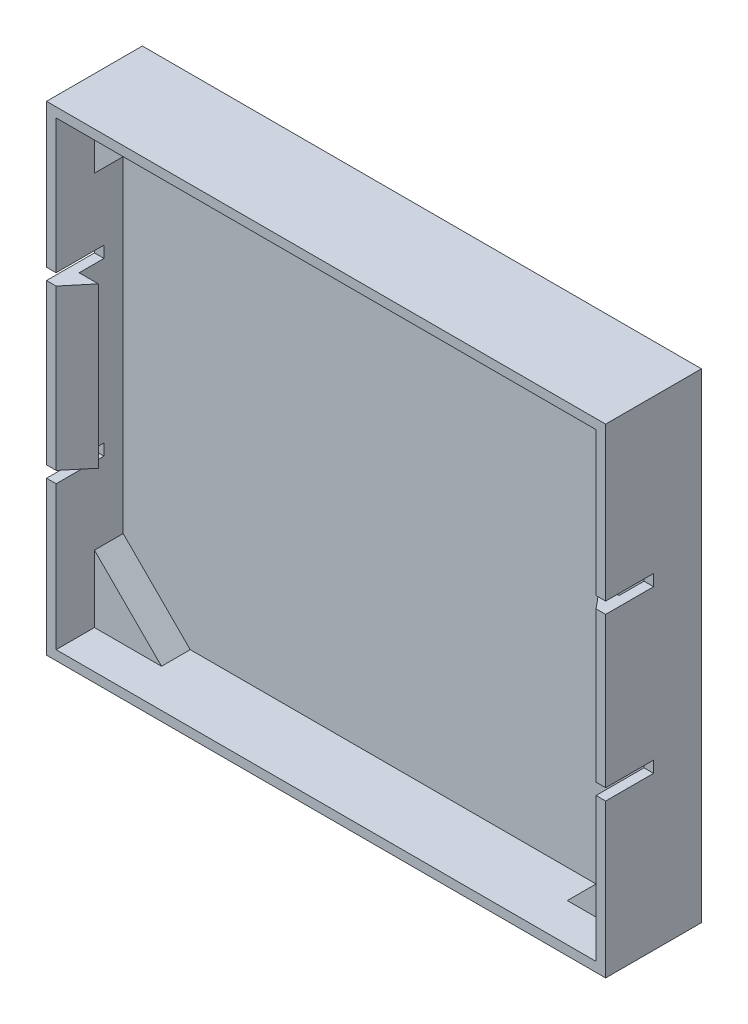
ISO-10303-21;
HEADER;
FILE_DESCRIPTION(('STEP AP214'),'2;1');
FILE_NAME('part.step','',(''),(''),'','','');
FILE_SCHEMA(('AUTOMOTIVE_DESIGN { 1 0 10303 214 1 1 1 1 }'));
ENDSEC;
DATA;
#1=APPLICATION_CONTEXT('core data for automotive mechanical design processes');
#2=APPLICATION_PROTOCOL_DEFINITION('international standard','automotive_design',2000,#1);
#3=PRODUCT_CONTEXT('',#1,'mechanical');
#4=PRODUCT('Part','Part','',(#3));
#5=PRODUCT_RELATED_PRODUCT_CATEGORY('part','',(#4));
#6=PRODUCT_DEFINITION_FORMATION('','',#4);
#7=PRODUCT_DEFINITION_CONTEXT('part definition',#1,'design');
#8=PRODUCT_DEFINITION('design','',#6,#7);
#9=PRODUCT_DEFINITION_SHAPE('','',#8);
#10=(LENGTH_UNIT() NAMED_UNIT(*) SI_UNIT(.MILLI.,.METRE.));
#11=(NAMED_UNIT(*) PLANE_ANGLE_UNIT() SI_UNIT($,.RADIAN.));
#12=(NAMED_UNIT(*) SI_UNIT($,.STERADIAN.) SOLID_ANGLE_UNIT());
#13=UNCERTAINTY_MEASURE_WITH_UNIT(LENGTH_MEASURE(1.E-05),#10,'distance_accuracy_value','');
#14=(GEOMETRIC_REPRESENTATION_CONTEXT(3) GLOBAL_UNCERTAINTY_ASSIGNED_CONTEXT((#13)) GLOBAL_UNIT_ASSIGNED_CONTEXT((#10,
#11,#12)) REPRESENTATION_CONTEXT('',''));
#15=CARTESIAN_POINT('',(0.,0.,0.));
#16=DIRECTION('',(0.,0.,1.));
#17=DIRECTION('',(1.,0.,0.));
#18=AXIS2_PLACEMENT_3D('',#15,#16,#17);
#19=CARTESIAN_POINT('',(-23.8424324324324,30.8653603603604,10.));
#20=DIRECTION('',(1.,0.,0.));
#21=DIRECTION('',(0.,1.,0.));
#22=AXIS2_PLACEMENT_3D('',#19,#20,#21);
#23=PLANE('',#22);
#24=DIRECTION('',(0.,-1.,0.));
#25=VECTOR('',#24,1.);
#26=CARTESIAN_POINT('',(-23.8424324324324,18.789460230723,7.6));
#27=LINE('',#26,#25);
#28=CARTESIAN_POINT('',(-23.8424324324324,15.6653603603604,7.6));
#29=VERTEX_POINT('',#28);
#30=CARTESIAN_POINT('',(-23.8424324324324,-1.00463963963964,7.6));
#31=VERTEX_POINT('',#30);
#32=EDGE_CURVE('E55',#29,#31,#27,.T.);
#33=ORIENTED_EDGE('',*,*,#32,.T.);
#34=DIRECTION('',(0.,0.,1.));
#35=VECTOR('',#34,1.);
#36=CARTESIAN_POINT('',(-23.8424324324324,-1.00463963963964,5.));
#37=LINE('',#36,#35);
#38=CARTESIAN_POINT('',(-23.8424324324324,-1.00463963963964,5.));
#39=VERTEX_POINT('',#38);
#40=EDGE_CURVE('E448',#39,#31,#37,.T.);
#41=ORIENTED_EDGE('',*,*,#40,.F.);
#42=DIRECTION('',(0.,1.,0.));
#43=VECTOR('',#42,1.);
#44=CARTESIAN_POINT('',(-23.8424324324324,0.,5.));
#45=LINE('',#44,#43);
#46=CARTESIAN_POINT('',(-23.8424324324324,-2.20463963963964,5.));
#47=VERTEX_POINT('',#46);
#48=EDGE_CURVE('E432',#47,#39,#45,.T.);
#49=ORIENTED_EDGE('',*,*,#48,.F.);
#50=DIRECTION('',(0.,0.,1.));
#51=VECTOR('',#50,1.);
#52=CARTESIAN_POINT('',(-23.8424324324324,-2.20463963963964,5.));
#53=LINE('',#52,#51);
#54=CARTESIAN_POINT('',(-23.8424324324324,-2.20463963963964,10.));
#55=VERTEX_POINT('',#54);
#56=EDGE_CURVE('E454',#47,#55,#53,.T.);
#57=ORIENTED_EDGE('',*,*,#56,.T.);
#58=DIRECTION('',(0.,-1.,0.));
#59=VECTOR('',#58,1.);
#60=CARTESIAN_POINT('',(-23.8424324324324,30.8653603603604,10.));
#61=LINE('',#60,#59);
#62=CARTESIAN_POINT('',(-23.8424324324324,-17.2046396396396,10.));
#63=VERTEX_POINT('',#62);
#64=EDGE_CURVE('E559',#55,#63,#61,.T.);
#65=ORIENTED_EDGE('',*,*,#64,.T.);
#66=DIRECTION('',(0.,0.,-1.));
#67=VECTOR('',#66,1.);
#68=CARTESIAN_POINT('',(-23.8424324324324,-17.2046396396396,10.));
#69=LINE('',#68,#67);
#70=CARTESIAN_POINT('',(-23.8424324324324,-17.2046396396396,6.));
#71=VERTEX_POINT('',#70);
#72=EDGE_CURVE('E596',#63,#71,#69,.T.);
#73=ORIENTED_EDGE('',*,*,#72,.T.);
#74=DIRECTION('',(0.,-1.,0.));
#75=VECTOR('',#74,1.);
#76=CARTESIAN_POINT('',(-23.8424324324324,-17.2046396396396,6.));
#77=LINE('',#76,#75);
#78=CARTESIAN_POINT('',(-23.8424324324324,-10.2046396396396,6.));
#79=VERTEX_POINT('',#78);
#80=EDGE_CURVE('E476',#79,#71,#77,.T.);
#81=ORIENTED_EDGE('',*,*,#80,.F.);
#82=DIRECTION('',(0.,0.,-1.));
#83=VECTOR('',#82,1.);
#84=CARTESIAN_POINT('',(-23.8424324324324,-10.2046396396396,6.));
#85=LINE('',#84,#83);
#86=CARTESIAN_POINT('',(-23.8424324324324,-10.2046396396396,3.));
#87=VERTEX_POINT('',#86);
#88=EDGE_CURVE('E479',#79,#87,#85,.T.);
#89=ORIENTED_EDGE('',*,*,#88,.T.);
#90=DIRECTION('',(0.,-1.,0.));
#91=VECTOR('',#90,1.);
#92=CARTESIAN_POINT('',(-23.8424324324324,30.8653603603604,3.));
#93=LINE('',#92,#91);
#94=CARTESIAN_POINT('',(-23.8424324324324,23.8653603603604,3.));
#95=VERTEX_POINT('',#94);
#96=EDGE_CURVE('E552',#95,#87,#93,.T.);
#97=ORIENTED_EDGE('',*,*,#96,.F.);
#98=DIRECTION('',(0.,0.,-1.));
#99=VECTOR('',#98,1.);
#100=CARTESIAN_POINT('',(-23.8424324324324,23.8653603603604,6.));
#101=LINE('',#100,#99);
#102=CARTESIAN_POINT('',(-23.8424324324324,23.8653603603604,6.));
#103=VERTEX_POINT('',#102);
#104=EDGE_CURVE('E549',#103,#95,#101,.T.);
#105=ORIENTED_EDGE('',*,*,#104,.F.);
#106=DIRECTION('',(0.,-1.,0.));
#107=VECTOR('',#106,1.);
#108=CARTESIAN_POINT('',(-23.8424324324324,30.8653603603604,6.));
#109=LINE('',#108,#107);
#110=CARTESIAN_POINT('',(-23.8424324324324,30.8653603603604,6.));
#111=VERTEX_POINT('',#110);
#112=EDGE_CURVE('E536',#111,#103,#109,.T.);
#113=ORIENTED_EDGE('',*,*,#112,.F.);
#114=DIRECTION('',(0.,0.,-1.));
#115=VECTOR('',#114,1.);
#116=CARTESIAN_POINT('',(-23.8424324324324,30.8653603603604,10.));
#117=LINE('',#116,#115);
#118=CARTESIAN_POINT('',(-23.8424324324324,30.8653603603604,10.));
#119=VERTEX_POINT('',#118);
#120=EDGE_CURVE('E571',#119,#111,#117,.T.);
#121=ORIENTED_EDGE('',*,*,#120,.F.);
#122=CARTESIAN_POINT('',(-23.8424324324324,16.8653603603604,10.));
#123=VERTEX_POINT('',#122);
#124=EDGE_CURVE('E553',#119,#123,#61,.T.);
#125=ORIENTED_EDGE('',*,*,#124,.T.);
#126=DIRECTION('',(0.,0.,1.));
#127=VECTOR('',#126,1.);
#128=CARTESIAN_POINT('',(-23.8424324324324,16.8653603603604,5.));
#129=LINE('',#128,#127);
#130=CARTESIAN_POINT('',(-23.8424324324324,16.8653603603604,5.));
#131=VERTEX_POINT('',#130);
#132=EDGE_CURVE('E393',#131,#123,#129,.T.);
#133=ORIENTED_EDGE('',*,*,#132,.F.);
#134=DIRECTION('',(0.,1.,0.));
#135=VECTOR('',#134,1.);
#136=CARTESIAN_POINT('',(-23.8424324324324,0.,5.));
#137=LINE('',#136,#135);
#138=CARTESIAN_POINT('',(-23.8424324324324,15.6653603603604,5.));
#139=VERTEX_POINT('',#138);
#140=EDGE_CURVE('E367',#139,#131,#137,.T.);
#141=ORIENTED_EDGE('',*,*,#140,.F.);
#142=DIRECTION('',(0.,0.,1.));
#143=VECTOR('',#142,1.);
#144=CARTESIAN_POINT('',(-23.8424324324324,15.6653603603604,5.));
#145=LINE('',#144,#143);
#146=EDGE_CURVE('E60',#139,#29,#145,.T.);
#147=ORIENTED_EDGE('',*,*,#146,.T.);
#148=EDGE_LOOP('',(#33,#41,#49,#57,#65,#73,#81,#89,#97,#105,#113,#121,#125,#133,#141,#147));
#149=FACE_BOUND('',#148,.T.);
#150=ADVANCED_FACE('F39',(#149),#23,.T.);
#151=CARTESIAN_POINT('',(32.5175675675676,30.8653603603604,10.));
#152=DIRECTION('',(-1.,0.,0.));
#153=DIRECTION('',(0.,-1.,0.));
#154=AXIS2_PLACEMENT_3D('',#151,#152,#153);
#155=PLANE('',#154);
#156=DIRECTION('',(0.,-1.,0.));
#157=VECTOR('',#156,1.);
#158=CARTESIAN_POINT('',(32.5175675675676,17.789460230723,7.6));
#159=LINE('',#158,#157);
#160=CARTESIAN_POINT('',(32.5175675675676,14.6653603603604,7.6));
#161=VERTEX_POINT('',#160);
#162=CARTESIAN_POINT('',(32.5175675675676,-1.00463963963964,7.6));
#163=VERTEX_POINT('',#162);
#164=EDGE_CURVE('E321',#161,#163,#159,.T.);
#165=ORIENTED_EDGE('',*,*,#164,.F.);
#166=DIRECTION('',(0.,0.,1.));
#167=VECTOR('',#166,1.);
#168=CARTESIAN_POINT('',(32.5175675675676,14.6653603603604,5.));
#169=LINE('',#168,#167);
#170=CARTESIAN_POINT('',(32.5175675675676,14.6653603603604,5.));
#171=VERTEX_POINT('',#170);
#172=EDGE_CURVE('E349',#171,#161,#169,.T.);
#173=ORIENTED_EDGE('',*,*,#172,.F.);
#174=DIRECTION('',(0.,-1.,0.));
#175=VECTOR('',#174,1.);
#176=CARTESIAN_POINT('',(32.5175675675676,0.,5.));
#177=LINE('',#176,#175);
#178=CARTESIAN_POINT('',(32.5175675675676,15.8653603603604,5.));
#179=VERTEX_POINT('',#178);
#180=EDGE_CURVE('E340',#179,#171,#177,.T.);
#181=ORIENTED_EDGE('',*,*,#180,.F.);
#182=DIRECTION('',(0.,0.,1.));
#183=VECTOR('',#182,1.);
#184=CARTESIAN_POINT('',(32.5175675675676,15.8653603603604,5.));
#185=LINE('',#184,#183);
#186=CARTESIAN_POINT('',(32.5175675675676,15.8653603603604,10.));
#187=VERTEX_POINT('',#186);
#188=EDGE_CURVE('E354',#179,#187,#185,.T.);
#189=ORIENTED_EDGE('',*,*,#188,.T.);
#190=DIRECTION('',(0.,1.,0.));
#191=VECTOR('',#190,1.);
#192=CARTESIAN_POINT('',(32.5175675675676,30.8653603603604,10.));
#193=LINE('',#192,#191);
#194=CARTESIAN_POINT('',(32.5175675675676,30.8653603603604,10.));
#195=VERTEX_POINT('',#194);
#196=EDGE_CURVE('E562',#187,#195,#193,.T.);
#197=ORIENTED_EDGE('',*,*,#196,.T.);
#198=DIRECTION('',(0.,0.,-1.));
#199=VECTOR('',#198,1.);
#200=CARTESIAN_POINT('',(32.5175675675676,30.8653603603604,10.));
#201=LINE('',#200,#199);
#202=CARTESIAN_POINT('',(32.5175675675676,30.8653603603604,6.));
#203=VERTEX_POINT('',#202);
#204=EDGE_CURVE('E588',#195,#203,#201,.T.);
#205=ORIENTED_EDGE('',*,*,#204,.T.);
#206=DIRECTION('',(0.,1.,0.));
#207=VECTOR('',#206,1.);
#208=CARTESIAN_POINT('',(32.5175675675676,30.8653603603604,6.));
#209=LINE('',#208,#207);
#210=CARTESIAN_POINT('',(32.5175675675676,23.8653603603604,6.));
#211=VERTEX_POINT('',#210);
#212=EDGE_CURVE('E496',#211,#203,#209,.T.);
#213=ORIENTED_EDGE('',*,*,#212,.F.);
#214=DIRECTION('',(0.,0.,-1.));
#215=VECTOR('',#214,1.);
#216=CARTESIAN_POINT('',(32.5175675675676,23.8653603603604,6.));
#217=LINE('',#216,#215);
#218=CARTESIAN_POINT('',(32.5175675675676,23.8653603603604,3.));
#219=VERTEX_POINT('',#218);
#220=EDGE_CURVE('E499',#211,#219,#217,.T.);
#221=ORIENTED_EDGE('',*,*,#220,.T.);
#222=DIRECTION('',(0.,1.,0.));
#223=VECTOR('',#222,1.);
#224=CARTESIAN_POINT('',(32.5175675675676,30.8653603603604,3.));
#225=LINE('',#224,#223);
#226=CARTESIAN_POINT('',(32.5175675675676,-10.2046396396396,3.));
#227=VERTEX_POINT('',#226);
#228=EDGE_CURVE('E578',#227,#219,#225,.T.);
#229=ORIENTED_EDGE('',*,*,#228,.F.);
#230=DIRECTION('',(0.,0.,-1.));
#231=VECTOR('',#230,1.);
#232=CARTESIAN_POINT('',(32.5175675675676,-10.2046396396396,6.));
#233=LINE('',#232,#231);
#234=CARTESIAN_POINT('',(32.5175675675676,-10.2046396396396,6.));
#235=VERTEX_POINT('',#234);
#236=EDGE_CURVE('E528',#235,#227,#233,.T.);
#237=ORIENTED_EDGE('',*,*,#236,.F.);
#238=DIRECTION('',(0.,1.,0.));
#239=VECTOR('',#238,1.);
#240=CARTESIAN_POINT('',(32.5175675675676,-17.2046396396396,6.));
#241=LINE('',#240,#239);
#242=CARTESIAN_POINT('',(32.5175675675676,-17.2046396396396,6.));
#243=VERTEX_POINT('',#242);
#244=EDGE_CURVE('E513',#243,#235,#241,.T.);
#245=ORIENTED_EDGE('',*,*,#244,.F.);
#246=DIRECTION('',(0.,0.,-1.));
#247=VECTOR('',#246,1.);
#248=CARTESIAN_POINT('',(32.5175675675676,-17.2046396396396,10.));
#249=LINE('',#248,#247);
#250=CARTESIAN_POINT('',(32.5175675675676,-17.2046396396396,10.));
#251=VERTEX_POINT('',#250);
#252=EDGE_CURVE('E592',#251,#243,#249,.T.);
#253=ORIENTED_EDGE('',*,*,#252,.F.);
#254=CARTESIAN_POINT('',(32.5175675675676,-2.20463963963964,10.));
#255=VERTEX_POINT('',#254);
#256=EDGE_CURVE('E563',#251,#255,#193,.T.);
#257=ORIENTED_EDGE('',*,*,#256,.T.);
#258=DIRECTION('',(0.,0.,1.));
#259=VECTOR('',#258,1.);
#260=CARTESIAN_POINT('',(32.5175675675676,-2.20463963963964,5.));
#261=LINE('',#260,#259);
#262=CARTESIAN_POINT('',(32.5175675675676,-2.20463963963964,5.));
#263=VERTEX_POINT('',#262);
#264=EDGE_CURVE('E424',#263,#255,#261,.T.);
#265=ORIENTED_EDGE('',*,*,#264,.F.);
#266=DIRECTION('',(0.,-1.,0.));
#267=VECTOR('',#266,1.);
#268=CARTESIAN_POINT('',(32.5175675675676,0.,5.));
#269=LINE('',#268,#267);
#270=CARTESIAN_POINT('',(32.5175675675676,-1.00463963963964,5.));
#271=VERTEX_POINT('',#270);
#272=EDGE_CURVE('E407',#271,#263,#269,.T.);
#273=ORIENTED_EDGE('',*,*,#272,.F.);
#274=DIRECTION('',(0.,0.,1.));
#275=VECTOR('',#274,1.);
#276=CARTESIAN_POINT('',(32.5175675675676,-1.00463963963964,5.));
#277=LINE('',#276,#275);
#278=EDGE_CURVE('E427',#271,#163,#277,.T.);
#279=ORIENTED_EDGE('',*,*,#278,.T.);
#280=EDGE_LOOP('',(#165,#173,#181,#189,#197,#205,#213,#221,#229,#237,#245,#253,#257,#265,#273,#279));
#281=FACE_BOUND('',#280,.T.);
#282=ADVANCED_FACE('F688',(#281),#155,.T.);
#283=CARTESIAN_POINT('',(-24.8424324324324,31.8653603603604,3.));
#284=DIRECTION('',(1.,0.,0.));
#285=DIRECTION('',(0.,1.,0.));
#286=AXIS2_PLACEMENT_3D('',#283,#284,#285);
#287=PLANE('',#286);
#288=DIRECTION('',(0.,0.,1.));
#289=VECTOR('',#288,1.);
#290=CARTESIAN_POINT('',(-24.8424324324324,15.6653603603604,5.));
#291=LINE('',#290,#289);
#292=CARTESIAN_POINT('',(-24.8424324324324,15.6653603603604,5.));
#293=VERTEX_POINT('',#292);
#294=CARTESIAN_POINT('',(-24.8424324324324,15.6653603603604,10.));
#295=VERTEX_POINT('',#294);
#296=EDGE_CURVE('E385',#293,#295,#291,.T.);
#297=ORIENTED_EDGE('',*,*,#296,.F.);
#298=DIRECTION('',(0.,-1.,0.));
#299=VECTOR('',#298,1.);
#300=CARTESIAN_POINT('',(-24.8424324324324,0.,5.));
#301=LINE('',#300,#299);
#302=CARTESIAN_POINT('',(-24.8424324324324,16.8653603603604,5.));
#303=VERTEX_POINT('',#302);
#304=EDGE_CURVE('E376',#303,#293,#301,.T.);
#305=ORIENTED_EDGE('',*,*,#304,.F.);
#306=DIRECTION('',(0.,0.,1.));
#307=VECTOR('',#306,1.);
#308=CARTESIAN_POINT('',(-24.8424324324324,16.8653603603604,5.));
#309=LINE('',#308,#307);
#310=CARTESIAN_POINT('',(-24.8424324324324,16.8653603603604,10.));
#311=VERTEX_POINT('',#310);
#312=EDGE_CURVE('E389',#303,#311,#309,.T.);
#313=ORIENTED_EDGE('',*,*,#312,.T.);
#314=DIRECTION('',(0.,-1.,0.));
#315=VECTOR('',#314,1.);
#316=CARTESIAN_POINT('',(-24.8424324324324,31.8653603603604,10.));
#317=LINE('',#316,#315);
#318=CARTESIAN_POINT('',(-24.8424324324324,31.8653603603604,10.));
#319=VERTEX_POINT('',#318);
#320=EDGE_CURVE('E601',#319,#311,#317,.T.);
#321=ORIENTED_EDGE('',*,*,#320,.F.);
#322=DIRECTION('',(0.,0.,-1.));
#323=VECTOR('',#322,1.);
#324=CARTESIAN_POINT('',(-24.8424324324324,31.8653603603604,3.));
#325=LINE('',#324,#323);
#326=CARTESIAN_POINT('',(-24.8424324324324,31.8653603603604,0.));
#327=VERTEX_POINT('',#326);
#328=EDGE_CURVE('E633',#319,#327,#325,.T.);
#329=ORIENTED_EDGE('',*,*,#328,.T.);
#330=DIRECTION('',(0.,-1.,0.));
#331=VECTOR('',#330,1.);
#332=CARTESIAN_POINT('',(-24.8424324324324,31.8653603603604,0.));
#333=LINE('',#332,#331);
#334=CARTESIAN_POINT('',(-24.8424324324324,-18.2046396396396,0.));
#335=VERTEX_POINT('',#334);
#336=EDGE_CURVE('E620',#327,#335,#333,.T.);
#337=ORIENTED_EDGE('',*,*,#336,.T.);
#338=DIRECTION('',(0.,0.,-1.));
#339=VECTOR('',#338,1.);
#340=CARTESIAN_POINT('',(-24.8424324324324,-18.2046396396396,3.));
#341=LINE('',#340,#339);
#342=CARTESIAN_POINT('',(-24.8424324324324,-18.2046396396396,10.));
#343=VERTEX_POINT('',#342);
#344=EDGE_CURVE('E11',#343,#335,#341,.T.);
#345=ORIENTED_EDGE('',*,*,#344,.F.);
#346=CARTESIAN_POINT('',(-24.8424324324324,-2.20463963963964,10.));
#347=VERTEX_POINT('',#346);
#348=EDGE_CURVE('E600',#347,#343,#317,.T.);
#349=ORIENTED_EDGE('',*,*,#348,.F.);
#350=DIRECTION('',(0.,0.,1.));
#351=VECTOR('',#350,1.);
#352=CARTESIAN_POINT('',(-24.8424324324324,-2.20463963963964,5.));
#353=LINE('',#352,#351);
#354=CARTESIAN_POINT('',(-24.8424324324324,-2.20463963963964,5.));
#355=VERTEX_POINT('',#354);
#356=EDGE_CURVE('E459',#355,#347,#353,.T.);
#357=ORIENTED_EDGE('',*,*,#356,.F.);
#358=DIRECTION('',(0.,-1.,0.));
#359=VECTOR('',#358,1.);
#360=CARTESIAN_POINT('',(-24.8424324324324,0.,5.));
#361=LINE('',#360,#359);
#362=CARTESIAN_POINT('',(-24.8424324324324,-1.00463963963964,5.));
#363=VERTEX_POINT('',#362);
#364=EDGE_CURVE('E441',#363,#355,#361,.T.);
#365=ORIENTED_EDGE('',*,*,#364,.F.);
#366=DIRECTION('',(0.,0.,1.));
#367=VECTOR('',#366,1.);
#368=CARTESIAN_POINT('',(-24.8424324324324,-1.00463963963964,5.));
#369=LINE('',#368,#367);
#370=CARTESIAN_POINT('',(-24.8424324324324,-1.00463963963964,10.));
#371=VERTEX_POINT('',#370);
#372=EDGE_CURVE('E462',#363,#371,#369,.T.);
#373=ORIENTED_EDGE('',*,*,#372,.T.);
#374=EDGE_CURVE('E606',#295,#371,#317,.T.);
#375=ORIENTED_EDGE('',*,*,#374,.F.);
#376=EDGE_LOOP('',(#297,#305,#313,#321,#329,#337,#345,#349,#357,#365,#373,#375));
#377=FACE_BOUND('',#376,.T.);
#378=ADVANCED_FACE('F41',(#377),#287,.F.);
#379=CARTESIAN_POINT('',(33.5175675675676,31.8653603603604,3.));
#380=DIRECTION('',(-1.,0.,0.));
#381=DIRECTION('',(0.,-1.,0.));
#382=AXIS2_PLACEMENT_3D('',#379,#380,#381);
#383=PLANE('',#382);
#384=DIRECTION('',(0.,0.,1.));
#385=VECTOR('',#384,1.);
#386=CARTESIAN_POINT('',(33.5175675675676,-2.20463963963964,5.));
#387=LINE('',#386,#385);
#388=CARTESIAN_POINT('',(33.5175675675676,-2.20463963963964,5.));
#389=VERTEX_POINT('',#388);
#390=CARTESIAN_POINT('',(33.5175675675676,-2.20463963963964,10.));
#391=VERTEX_POINT('',#390);
#392=EDGE_CURVE('E382',#389,#391,#387,.T.);
#393=ORIENTED_EDGE('',*,*,#392,.T.);
#394=DIRECTION('',(0.,1.,0.));
#395=VECTOR('',#394,1.);
#396=CARTESIAN_POINT('',(33.5175675675676,31.8653603603604,10.));
#397=LINE('',#396,#395);
#398=CARTESIAN_POINT('',(33.5175675675676,-18.2046396396396,10.));
#399=VERTEX_POINT('',#398);
#400=EDGE_CURVE('E611',#399,#391,#397,.T.);
#401=ORIENTED_EDGE('',*,*,#400,.F.);
#402=DIRECTION('',(0.,0.,-1.));
#403=VECTOR('',#402,1.);
#404=CARTESIAN_POINT('',(33.5175675675676,-18.2046396396396,3.));
#405=LINE('',#404,#403);
#406=CARTESIAN_POINT('',(33.5175675675676,-18.2046396396396,0.));
#407=VERTEX_POINT('',#406);
#408=EDGE_CURVE('E48',#399,#407,#405,.T.);
#409=ORIENTED_EDGE('',*,*,#408,.T.);
#410=DIRECTION('',(0.,1.,0.));
#411=VECTOR('',#410,1.);
#412=CARTESIAN_POINT('',(33.5175675675676,31.8653603603604,0.));
#413=LINE('',#412,#411);
#414=CARTESIAN_POINT('',(33.5175675675676,31.8653603603604,0.));
#415=VERTEX_POINT('',#414);
#416=EDGE_CURVE('E627',#407,#415,#413,.T.);
#417=ORIENTED_EDGE('',*,*,#416,.T.);
#418=DIRECTION('',(0.,0.,-1.));
#419=VECTOR('',#418,1.);
#420=CARTESIAN_POINT('',(33.5175675675676,31.8653603603604,3.));
#421=LINE('',#420,#419);
#422=CARTESIAN_POINT('',(33.5175675675676,31.8653603603604,10.));
#423=VERTEX_POINT('',#422);
#424=EDGE_CURVE('E637',#423,#415,#421,.T.);
#425=ORIENTED_EDGE('',*,*,#424,.F.);
#426=CARTESIAN_POINT('',(33.5175675675676,15.8653603603604,10.));
#427=VERTEX_POINT('',#426);
#428=EDGE_CURVE('E610',#427,#423,#397,.T.);
#429=ORIENTED_EDGE('',*,*,#428,.F.);
#430=DIRECTION('',(0.,0.,1.));
#431=VECTOR('',#430,1.);
#432=CARTESIAN_POINT('',(33.5175675675676,15.8653603603604,5.));
#433=LINE('',#432,#431);
#434=CARTESIAN_POINT('',(33.5175675675676,15.8653603603604,5.));
#435=VERTEX_POINT('',#434);
#436=EDGE_CURVE('E358',#435,#427,#433,.T.);
#437=ORIENTED_EDGE('',*,*,#436,.F.);
#438=DIRECTION('',(0.,1.,0.));
#439=VECTOR('',#438,1.);
#440=CARTESIAN_POINT('',(33.5175675675676,0.,5.));
#441=LINE('',#440,#439);
#442=CARTESIAN_POINT('',(33.5175675675676,14.6653603603604,5.));
#443=VERTEX_POINT('',#442);
#444=EDGE_CURVE('E331',#443,#435,#441,.T.);
#445=ORIENTED_EDGE('',*,*,#444,.F.);
#446=DIRECTION('',(0.,0.,1.));
#447=VECTOR('',#446,1.);
#448=CARTESIAN_POINT('',(33.5175675675676,14.6653603603604,5.));
#449=LINE('',#448,#447);
#450=CARTESIAN_POINT('',(33.5175675675676,14.6653603603604,10.));
#451=VERTEX_POINT('',#450);
#452=EDGE_CURVE('E344',#443,#451,#449,.T.);
#453=ORIENTED_EDGE('',*,*,#452,.T.);
#454=CARTESIAN_POINT('',(33.5175675675676,-1.00463963963965,10.));
#455=VERTEX_POINT('',#454);
#456=EDGE_CURVE('E616',#455,#451,#397,.T.);
#457=ORIENTED_EDGE('',*,*,#456,.F.);
#458=DIRECTION('',(0.,0.,1.));
#459=VECTOR('',#458,1.);
#460=CARTESIAN_POINT('',(33.5175675675676,-1.00463963963964,5.));
#461=LINE('',#460,#459);
#462=CARTESIAN_POINT('',(33.5175675675676,-1.00463963963964,5.));
#463=VERTEX_POINT('',#462);
#464=EDGE_CURVE('E414',#463,#455,#461,.T.);
#465=ORIENTED_EDGE('',*,*,#464,.F.);
#466=DIRECTION('',(0.,1.,0.));
#467=VECTOR('',#466,1.);
#468=CARTESIAN_POINT('',(33.5175675675676,0.,5.));
#469=LINE('',#468,#467);
#470=EDGE_CURVE('E398',#389,#463,#469,.T.);
#471=ORIENTED_EDGE('',*,*,#470,.F.);
#472=EDGE_LOOP('',(#393,#401,#409,#417,#425,#429,#437,#445,#453,#457,#465,#471));
#473=FACE_BOUND('',#472,.T.);
#474=ADVANCED_FACE('F645',(#473),#383,.F.);
#475=CARTESIAN_POINT('',(0.,0.,10.));
#476=DIRECTION('',(0.,0.,1.));
#477=DIRECTION('',(1.,0.,0.));
#478=AXIS2_PLACEMENT_3D('',#475,#476,#477);
#479=PLANE('',#478);
#480=CARTESIAN_POINT('',(-23.8424324324324,15.6653603603604,10.));
#481=VERTEX_POINT('',#480);
#482=CARTESIAN_POINT('',(-23.8424324324324,-1.00463963963965,10.));
#483=VERTEX_POINT('',#482);
#484=EDGE_CURVE('E558',#481,#483,#61,.T.);
#485=ORIENTED_EDGE('',*,*,#484,.F.);
#486=DIRECTION('',(-1.,0.,0.));
#487=VECTOR('',#486,1.);
#488=CARTESIAN_POINT('',(0.,15.6653603603604,10.));
#489=LINE('',#488,#487);
#490=EDGE_CURVE('E279',#481,#295,#489,.T.);
#491=ORIENTED_EDGE('',*,*,#490,.T.);
#492=ORIENTED_EDGE('',*,*,#374,.T.);
#493=DIRECTION('',(-1.,0.,0.));
#494=VECTOR('',#493,1.);
#495=CARTESIAN_POINT('',(0.,-1.00463963963964,10.));
#496=LINE('',#495,#494);
#497=EDGE_CURVE('E388',#483,#371,#496,.T.);
#498=ORIENTED_EDGE('',*,*,#497,.F.);
#499=EDGE_LOOP('',(#485,#491,#492,#498));
#500=FACE_BOUND('',#499,.T.);
#501=ADVANCED_FACE('F762',(#500),#479,.T.);
#502=ORIENTED_EDGE('',*,*,#400,.T.);
#503=DIRECTION('',(-1.,0.,0.));
#504=VECTOR('',#503,1.);
#505=CARTESIAN_POINT('',(0.,-2.20463963963964,10.));
#506=LINE('',#505,#504);
#507=EDGE_CURVE('E403',#391,#255,#506,.T.);
#508=ORIENTED_EDGE('',*,*,#507,.T.);
#509=ORIENTED_EDGE('',*,*,#256,.F.);
#510=DIRECTION('',(1.,0.,0.));
#511=VECTOR('',#510,1.);
#512=CARTESIAN_POINT('',(-23.8424324324324,-17.2046396396396,10.));
#513=LINE('',#512,#511);
#514=EDGE_CURVE('E557',#63,#251,#513,.T.);
#515=ORIENTED_EDGE('',*,*,#514,.F.);
#516=ORIENTED_EDGE('',*,*,#64,.F.);
#517=DIRECTION('',(-1.,0.,0.));
#518=VECTOR('',#517,1.);
#519=CARTESIAN_POINT('',(0.,-2.20463963963963,10.));
#520=LINE('',#519,#518);
#521=EDGE_CURVE('E437',#55,#347,#520,.T.);
#522=ORIENTED_EDGE('',*,*,#521,.T.);
#523=ORIENTED_EDGE('',*,*,#348,.T.);
#524=DIRECTION('',(1.,0.,0.));
#525=VECTOR('',#524,1.);
#526=CARTESIAN_POINT('',(-24.8424324324324,-18.2046396396396,10.));
#527=LINE('',#526,#525);
#528=EDGE_CURVE('E605',#343,#399,#527,.T.);
#529=ORIENTED_EDGE('',*,*,#528,.T.);
#530=EDGE_LOOP('',(#502,#508,#509,#515,#516,#522,#523,#529));
#531=FACE_BOUND('',#530,.T.);
#532=ADVANCED_FACE('F765',(#531),#479,.T.);
#533=DIRECTION('',(-1.,0.,0.));
#534=VECTOR('',#533,1.);
#535=CARTESIAN_POINT('',(0.,-1.00463963963965,10.));
#536=LINE('',#535,#534);
#537=CARTESIAN_POINT('',(32.5175675675676,-1.00463963963964,10.));
#538=VERTEX_POINT('',#537);
#539=EDGE_CURVE('E353',#455,#538,#536,.T.);
#540=ORIENTED_EDGE('',*,*,#539,.F.);
#541=ORIENTED_EDGE('',*,*,#456,.T.);
#542=DIRECTION('',(-1.,0.,0.));
#543=VECTOR('',#542,1.);
#544=CARTESIAN_POINT('',(0.,14.6653603603604,10.));
#545=LINE('',#544,#543);
#546=CARTESIAN_POINT('',(32.5175675675676,14.6653603603604,10.));
#547=VERTEX_POINT('',#546);
#548=EDGE_CURVE('E325',#451,#547,#545,.T.);
#549=ORIENTED_EDGE('',*,*,#548,.T.);
#550=EDGE_CURVE('E568',#538,#547,#193,.T.);
#551=ORIENTED_EDGE('',*,*,#550,.F.);
#552=EDGE_LOOP('',(#540,#541,#549,#551));
#553=FACE_BOUND('',#552,.T.);
#554=ADVANCED_FACE('F675',(#553),#479,.T.);
#555=DIRECTION('',(-1.,0.,0.));
#556=VECTOR('',#555,1.);
#557=CARTESIAN_POINT('',(0.,16.8653603603604,10.));
#558=LINE('',#557,#556);
#559=EDGE_CURVE('E368',#123,#311,#558,.T.);
#560=ORIENTED_EDGE('',*,*,#559,.F.);
#561=ORIENTED_EDGE('',*,*,#124,.F.);
#562=DIRECTION('',(-1.,0.,0.));
#563=VECTOR('',#562,1.);
#564=CARTESIAN_POINT('',(-23.8424324324324,30.8653603603604,10.));
#565=LINE('',#564,#563);
#566=EDGE_CURVE('E567',#195,#119,#565,.T.);
#567=ORIENTED_EDGE('',*,*,#566,.F.);
#568=ORIENTED_EDGE('',*,*,#196,.F.);
#569=DIRECTION('',(-1.,0.,0.));
#570=VECTOR('',#569,1.);
#571=CARTESIAN_POINT('',(0.,15.8653603603605,10.));
#572=LINE('',#571,#570);
#573=EDGE_CURVE('E332',#427,#187,#572,.T.);
#574=ORIENTED_EDGE('',*,*,#573,.F.);
#575=ORIENTED_EDGE('',*,*,#428,.T.);
#576=DIRECTION('',(-1.,0.,0.));
#577=VECTOR('',#576,1.);
#578=CARTESIAN_POINT('',(-24.8424324324324,31.8653603603604,10.));
#579=LINE('',#578,#577);
#580=EDGE_CURVE('E615',#423,#319,#579,.T.);
#581=ORIENTED_EDGE('',*,*,#580,.T.);
#582=ORIENTED_EDGE('',*,*,#320,.T.);
#583=EDGE_LOOP('',(#560,#561,#567,#568,#574,#575,#581,#582));
#584=FACE_BOUND('',#583,.T.);
#585=ADVANCED_FACE('F663',(#584),#479,.T.);
#586=CARTESIAN_POINT('',(0.,0.,3.));
#587=DIRECTION('',(0.,0.,1.));
#588=DIRECTION('',(1.,0.,0.));
#589=AXIS2_PLACEMENT_3D('',#586,#587,#588);
#590=PLANE('',#589);
#591=ORIENTED_EDGE('',*,*,#96,.T.);
#592=DIRECTION('',(-0.707106781186548,0.707106781186547,0.));
#593=VECTOR('',#592,1.);
#594=CARTESIAN_POINT('',(-23.8424324324324,-10.2046396396396,3.));
#595=LINE('',#594,#593);
#596=CARTESIAN_POINT('',(-16.8424324324324,-17.2046396396396,3.));
#597=VERTEX_POINT('',#596);
#598=EDGE_CURVE('E458',#597,#87,#595,.T.);
#599=ORIENTED_EDGE('',*,*,#598,.F.);
#600=DIRECTION('',(1.,0.,0.));
#601=VECTOR('',#600,1.);
#602=CARTESIAN_POINT('',(-23.8424324324324,-17.2046396396396,3.));
#603=LINE('',#602,#601);
#604=CARTESIAN_POINT('',(25.5175675675676,-17.2046396396396,3.));
#605=VERTEX_POINT('',#604);
#606=EDGE_CURVE('E575',#597,#605,#603,.T.);
#607=ORIENTED_EDGE('',*,*,#606,.T.);
#608=DIRECTION('',(-0.707106781186547,-0.707106781186547,0.));
#609=VECTOR('',#608,1.);
#610=CARTESIAN_POINT('',(32.5175675675676,-10.2046396396396,3.));
#611=LINE('',#610,#609);
#612=EDGE_CURVE('E508',#227,#605,#611,.T.);
#613=ORIENTED_EDGE('',*,*,#612,.F.);
#614=ORIENTED_EDGE('',*,*,#228,.T.);
#615=DIRECTION('',(0.707106781186549,-0.707106781186546,0.));
#616=VECTOR('',#615,1.);
#617=CARTESIAN_POINT('',(32.5175675675676,23.8653603603604,3.));
#618=LINE('',#617,#616);
#619=CARTESIAN_POINT('',(25.5175675675676,30.8653603603604,3.));
#620=VERTEX_POINT('',#619);
#621=EDGE_CURVE('E488',#620,#219,#618,.T.);
#622=ORIENTED_EDGE('',*,*,#621,.F.);
#623=DIRECTION('',(-1.,0.,0.));
#624=VECTOR('',#623,1.);
#625=CARTESIAN_POINT('',(-23.8424324324324,30.8653603603604,3.));
#626=LINE('',#625,#624);
#627=CARTESIAN_POINT('',(-16.8424324324324,30.8653603603604,3.));
#628=VERTEX_POINT('',#627);
#629=EDGE_CURVE('E582',#620,#628,#626,.T.);
#630=ORIENTED_EDGE('',*,*,#629,.T.);
#631=DIRECTION('',(0.707106781186547,0.707106781186547,0.));
#632=VECTOR('',#631,1.);
#633=CARTESIAN_POINT('',(-23.8424324324324,23.8653603603604,3.));
#634=LINE('',#633,#632);
#635=EDGE_CURVE('E532',#95,#628,#634,.T.);
#636=ORIENTED_EDGE('',*,*,#635,.F.);
#637=EDGE_LOOP('',(#591,#599,#607,#613,#614,#622,#630,#636));
#638=FACE_BOUND('',#637,.T.);
#639=ADVANCED_FACE('F721',(#638),#590,.T.);
#640=CARTESIAN_POINT('',(-23.8424324324324,-17.2046396396396,10.));
#641=DIRECTION('',(0.,1.,0.));
#642=DIRECTION('',(0.,0.,1.));
#643=AXIS2_PLACEMENT_3D('',#640,#641,#642);
#644=PLANE('',#643);
#645=ORIENTED_EDGE('',*,*,#606,.F.);
#646=DIRECTION('',(0.,0.,-1.));
#647=VECTOR('',#646,1.);
#648=CARTESIAN_POINT('',(-16.8424324324324,-17.2046396396396,6.));
#649=LINE('',#648,#647);
#650=CARTESIAN_POINT('',(-16.8424324324324,-17.2046396396396,6.));
#651=VERTEX_POINT('',#650);
#652=EDGE_CURVE('E485',#651,#597,#649,.T.);
#653=ORIENTED_EDGE('',*,*,#652,.F.);
#654=DIRECTION('',(1.,0.,0.));
#655=VECTOR('',#654,1.);
#656=CARTESIAN_POINT('',(-16.8424324324324,-17.2046396396396,6.));
#657=LINE('',#656,#655);
#658=EDGE_CURVE('E468',#71,#651,#657,.T.);
#659=ORIENTED_EDGE('',*,*,#658,.F.);
#660=ORIENTED_EDGE('',*,*,#72,.F.);
#661=ORIENTED_EDGE('',*,*,#514,.T.);
#662=ORIENTED_EDGE('',*,*,#252,.T.);
#663=DIRECTION('',(1.,0.,0.));
#664=VECTOR('',#663,1.);
#665=CARTESIAN_POINT('',(25.5175675675676,-17.2046396396396,6.));
#666=LINE('',#665,#664);
#667=CARTESIAN_POINT('',(25.5175675675676,-17.2046396396396,6.));
#668=VERTEX_POINT('',#667);
#669=EDGE_CURVE('E509',#668,#243,#666,.T.);
#670=ORIENTED_EDGE('',*,*,#669,.F.);
#671=DIRECTION('',(0.,0.,-1.));
#672=VECTOR('',#671,1.);
#673=CARTESIAN_POINT('',(25.5175675675676,-17.2046396396396,6.));
#674=LINE('',#673,#672);
#675=EDGE_CURVE('E521',#668,#605,#674,.T.);
#676=ORIENTED_EDGE('',*,*,#675,.T.);
#677=EDGE_LOOP('',(#645,#653,#659,#660,#661,#662,#670,#676));
#678=FACE_BOUND('',#677,.T.);
#679=ADVANCED_FACE('F734',(#678),#644,.T.);
#680=CARTESIAN_POINT('',(-23.8424324324324,30.8653603603604,10.));
#681=DIRECTION('',(0.,-1.,0.));
#682=DIRECTION('',(0.,0.,-1.));
#683=AXIS2_PLACEMENT_3D('',#680,#681,#682);
#684=PLANE('',#683);
#685=ORIENTED_EDGE('',*,*,#629,.F.);
#686=DIRECTION('',(0.,0.,-1.));
#687=VECTOR('',#686,1.);
#688=CARTESIAN_POINT('',(25.5175675675676,30.8653603603604,6.));
#689=LINE('',#688,#687);
#690=CARTESIAN_POINT('',(25.5175675675676,30.8653603603604,6.));
#691=VERTEX_POINT('',#690);
#692=EDGE_CURVE('E505',#691,#620,#689,.T.);
#693=ORIENTED_EDGE('',*,*,#692,.F.);
#694=DIRECTION('',(-1.,0.,0.));
#695=VECTOR('',#694,1.);
#696=CARTESIAN_POINT('',(25.5175675675676,30.8653603603604,6.));
#697=LINE('',#696,#695);
#698=EDGE_CURVE('E489',#203,#691,#697,.T.);
#699=ORIENTED_EDGE('',*,*,#698,.F.);
#700=ORIENTED_EDGE('',*,*,#204,.F.);
#701=ORIENTED_EDGE('',*,*,#566,.T.);
#702=ORIENTED_EDGE('',*,*,#120,.T.);
#703=DIRECTION('',(-1.,0.,0.));
#704=VECTOR('',#703,1.);
#705=CARTESIAN_POINT('',(-16.8424324324324,30.8653603603604,6.));
#706=LINE('',#705,#704);
#707=CARTESIAN_POINT('',(-16.8424324324324,30.8653603603604,6.));
#708=VERTEX_POINT('',#707);
#709=EDGE_CURVE('E533',#708,#111,#706,.T.);
#710=ORIENTED_EDGE('',*,*,#709,.F.);
#711=DIRECTION('',(0.,0.,-1.));
#712=VECTOR('',#711,1.);
#713=CARTESIAN_POINT('',(-16.8424324324324,30.8653603603604,6.));
#714=LINE('',#713,#712);
#715=EDGE_CURVE('E542',#708,#628,#714,.T.);
#716=ORIENTED_EDGE('',*,*,#715,.T.);
#717=EDGE_LOOP('',(#685,#693,#699,#700,#701,#702,#710,#716));
#718=FACE_BOUND('',#717,.T.);
#719=ADVANCED_FACE('F705',(#718),#684,.T.);
#720=CARTESIAN_POINT('',(-24.8424324324324,-18.2046396396396,3.));
#721=DIRECTION('',(0.,1.,0.));
#722=DIRECTION('',(0.,0.,1.));
#723=AXIS2_PLACEMENT_3D('',#720,#721,#722);
#724=PLANE('',#723);
#725=DIRECTION('',(1.,0.,0.));
#726=VECTOR('',#725,1.);
#727=CARTESIAN_POINT('',(-24.8424324324324,-18.2046396396396,0.));
#728=LINE('',#727,#726);
#729=EDGE_CURVE('E624',#335,#407,#728,.T.);
#730=ORIENTED_EDGE('',*,*,#729,.T.);
#731=ORIENTED_EDGE('',*,*,#408,.F.);
#732=ORIENTED_EDGE('',*,*,#528,.F.);
#733=ORIENTED_EDGE('',*,*,#344,.T.);
#734=EDGE_LOOP('',(#730,#731,#732,#733));
#735=FACE_BOUND('',#734,.T.);
#736=ADVANCED_FACE('F773',(#735),#724,.F.);
#737=CARTESIAN_POINT('',(-24.8424324324324,31.8653603603604,3.));
#738=DIRECTION('',(0.,-1.,0.));
#739=DIRECTION('',(0.,0.,-1.));
#740=AXIS2_PLACEMENT_3D('',#737,#738,#739);
#741=PLANE('',#740);
#742=DIRECTION('',(-1.,0.,0.));
#743=VECTOR('',#742,1.);
#744=CARTESIAN_POINT('',(-24.8424324324324,31.8653603603604,0.));
#745=LINE('',#744,#743);
#746=EDGE_CURVE('E630',#415,#327,#745,.T.);
#747=ORIENTED_EDGE('',*,*,#746,.T.);
#748=ORIENTED_EDGE('',*,*,#328,.F.);
#749=ORIENTED_EDGE('',*,*,#580,.F.);
#750=ORIENTED_EDGE('',*,*,#424,.T.);
#751=EDGE_LOOP('',(#747,#748,#749,#750));
#752=FACE_BOUND('',#751,.T.);
#753=ADVANCED_FACE('F654',(#752),#741,.F.);
#754=CARTESIAN_POINT('',(0.,0.,0.));
#755=DIRECTION('',(0.,0.,1.));
#756=DIRECTION('',(1.,0.,0.));
#757=AXIS2_PLACEMENT_3D('',#754,#755,#756);
#758=PLANE('',#757);
#759=ORIENTED_EDGE('',*,*,#336,.F.);
#760=ORIENTED_EDGE('',*,*,#746,.F.);
#761=ORIENTED_EDGE('',*,*,#416,.F.);
#762=ORIENTED_EDGE('',*,*,#729,.F.);
#763=EDGE_LOOP('',(#759,#760,#761,#762));
#764=FACE_BOUND('',#763,.T.);
#765=ADVANCED_FACE('F652',(#764),#758,.F.);
#766=CARTESIAN_POINT('',(-23.8424324324324,23.8653603603604,6.));
#767=DIRECTION('',(-0.707106781186548,0.707106781186548,0.));
#768=DIRECTION('',(-0.707106781186548,-0.707106781186548,0.));
#769=AXIS2_PLACEMENT_3D('',#766,#767,#768);
#770=PLANE('',#769);
#771=ORIENTED_EDGE('',*,*,#635,.T.);
#772=ORIENTED_EDGE('',*,*,#715,.F.);
#773=DIRECTION('',(0.707106781186547,0.707106781186547,0.));
#774=VECTOR('',#773,1.);
#775=CARTESIAN_POINT('',(-23.8424324324324,23.8653603603604,6.));
#776=LINE('',#775,#774);
#777=EDGE_CURVE('E539',#103,#708,#776,.T.);
#778=ORIENTED_EDGE('',*,*,#777,.F.);
#779=ORIENTED_EDGE('',*,*,#104,.T.);
#780=EDGE_LOOP('',(#771,#772,#778,#779));
#781=FACE_BOUND('',#780,.T.);
#782=ADVANCED_FACE('F717',(#781),#770,.F.);
#783=CARTESIAN_POINT('',(0.,0.,6.));
#784=DIRECTION('',(0.,0.,1.));
#785=DIRECTION('',(1.,0.,0.));
#786=AXIS2_PLACEMENT_3D('',#783,#784,#785);
#787=PLANE('',#786);
#788=ORIENTED_EDGE('',*,*,#709,.T.);
#789=ORIENTED_EDGE('',*,*,#112,.T.);
#790=ORIENTED_EDGE('',*,*,#777,.T.);
#791=EDGE_LOOP('',(#788,#789,#790));
#792=FACE_BOUND('',#791,.T.);
#793=ADVANCED_FACE('F714',(#792),#787,.T.);
#794=CARTESIAN_POINT('',(32.5175675675676,-10.2046396396396,6.));
#795=DIRECTION('',(0.707106781186548,-0.707106781186548,0.));
#796=DIRECTION('',(0.707106781186548,0.707106781186548,0.));
#797=AXIS2_PLACEMENT_3D('',#794,#795,#796);
#798=PLANE('',#797);
#799=ORIENTED_EDGE('',*,*,#612,.T.);
#800=ORIENTED_EDGE('',*,*,#675,.F.);
#801=DIRECTION('',(-0.707106781186547,-0.707106781186547,0.));
#802=VECTOR('',#801,1.);
#803=CARTESIAN_POINT('',(32.5175675675676,-10.2046396396396,6.));
#804=LINE('',#803,#802);
#805=EDGE_CURVE('E517',#235,#668,#804,.T.);
#806=ORIENTED_EDGE('',*,*,#805,.F.);
#807=ORIENTED_EDGE('',*,*,#236,.T.);
#808=EDGE_LOOP('',(#799,#800,#806,#807));
#809=FACE_BOUND('',#808,.T.);
#810=ADVANCED_FACE('F739',(#809),#798,.F.);
#811=CARTESIAN_POINT('',(0.,0.,6.));
#812=DIRECTION('',(0.,0.,1.));
#813=DIRECTION('',(1.,0.,0.));
#814=AXIS2_PLACEMENT_3D('',#811,#812,#813);
#815=PLANE('',#814);
#816=ORIENTED_EDGE('',*,*,#669,.T.);
#817=ORIENTED_EDGE('',*,*,#244,.T.);
#818=ORIENTED_EDGE('',*,*,#805,.T.);
#819=EDGE_LOOP('',(#816,#817,#818));
#820=FACE_BOUND('',#819,.T.);
#821=ADVANCED_FACE('F742',(#820),#815,.T.);
#822=CARTESIAN_POINT('',(32.5175675675676,23.8653603603604,6.));
#823=DIRECTION('',(0.707106781186546,0.707106781186548,0.));
#824=DIRECTION('',(-0.707106781186549,0.707106781186546,0.));
#825=AXIS2_PLACEMENT_3D('',#822,#823,#824);
#826=PLANE('',#825);
#827=ORIENTED_EDGE('',*,*,#621,.T.);
#828=ORIENTED_EDGE('',*,*,#220,.F.);
#829=DIRECTION('',(0.707106781186549,-0.707106781186546,0.));
#830=VECTOR('',#829,1.);
#831=CARTESIAN_POINT('',(32.5175675675676,23.8653603603604,6.));
#832=LINE('',#831,#830);
#833=EDGE_CURVE('E493',#691,#211,#832,.T.);
#834=ORIENTED_EDGE('',*,*,#833,.F.);
#835=ORIENTED_EDGE('',*,*,#692,.T.);
#836=EDGE_LOOP('',(#827,#828,#834,#835));
#837=FACE_BOUND('',#836,.T.);
#838=ADVANCED_FACE('F744',(#837),#826,.F.);
#839=CARTESIAN_POINT('',(0.,0.,6.));
#840=DIRECTION('',(0.,0.,-1.));
#841=DIRECTION('',(-1.,0.,0.));
#842=AXIS2_PLACEMENT_3D('',#839,#840,#841);
#843=PLANE('',#842);
#844=ORIENTED_EDGE('',*,*,#698,.T.);
#845=ORIENTED_EDGE('',*,*,#833,.T.);
#846=ORIENTED_EDGE('',*,*,#212,.T.);
#847=EDGE_LOOP('',(#844,#845,#846));
#848=FACE_BOUND('',#847,.T.);
#849=ADVANCED_FACE('F750',(#848),#843,.F.);
#850=CARTESIAN_POINT('',(-23.8424324324324,-10.2046396396396,6.));
#851=DIRECTION('',(-0.707106781186547,-0.707106781186548,0.));
#852=DIRECTION('',(0.707106781186548,-0.707106781186547,0.));
#853=AXIS2_PLACEMENT_3D('',#850,#851,#852);
#854=PLANE('',#853);
#855=ORIENTED_EDGE('',*,*,#598,.T.);
#856=ORIENTED_EDGE('',*,*,#88,.F.);
#857=DIRECTION('',(-0.707106781186548,0.707106781186547,0.));
#858=VECTOR('',#857,1.);
#859=CARTESIAN_POINT('',(-23.8424324324324,-10.2046396396396,6.));
#860=LINE('',#859,#858);
#861=EDGE_CURVE('E472',#651,#79,#860,.T.);
#862=ORIENTED_EDGE('',*,*,#861,.F.);
#863=ORIENTED_EDGE('',*,*,#652,.T.);
#864=EDGE_LOOP('',(#855,#856,#862,#863));
#865=FACE_BOUND('',#864,.T.);
#866=ADVANCED_FACE('F726',(#865),#854,.F.);
#867=CARTESIAN_POINT('',(0.,0.,6.));
#868=DIRECTION('',(0.,0.,-1.));
#869=DIRECTION('',(-1.,0.,0.));
#870=AXIS2_PLACEMENT_3D('',#867,#868,#869);
#871=PLANE('',#870);
#872=ORIENTED_EDGE('',*,*,#658,.T.);
#873=ORIENTED_EDGE('',*,*,#861,.T.);
#874=ORIENTED_EDGE('',*,*,#80,.T.);
#875=EDGE_LOOP('',(#872,#873,#874));
#876=FACE_BOUND('',#875,.T.);
#877=ADVANCED_FACE('F728',(#876),#871,.F.);
#878=CARTESIAN_POINT('',(0.,-2.20463963963963,5.));
#879=DIRECTION('',(0.,1.,0.));
#880=DIRECTION('',(-1.,0.,0.));
#881=AXIS2_PLACEMENT_3D('',#878,#879,#880);
#882=PLANE('',#881);
#883=ORIENTED_EDGE('',*,*,#521,.F.);
#884=ORIENTED_EDGE('',*,*,#56,.F.);
#885=DIRECTION('',(-1.,0.,0.));
#886=VECTOR('',#885,1.);
#887=CARTESIAN_POINT('',(0.,-2.20463963963963,5.));
#888=LINE('',#887,#886);
#889=EDGE_CURVE('E445',#47,#355,#888,.T.);
#890=ORIENTED_EDGE('',*,*,#889,.T.);
#891=ORIENTED_EDGE('',*,*,#356,.T.);
#892=EDGE_LOOP('',(#883,#884,#890,#891));
#893=FACE_BOUND('',#892,.T.);
#894=ADVANCED_FACE('F821',(#893),#882,.T.);
#895=CARTESIAN_POINT('',(0.,-1.00463963963964,5.));
#896=DIRECTION('',(0.,1.,0.));
#897=DIRECTION('',(-1.,0.,0.));
#898=AXIS2_PLACEMENT_3D('',#895,#896,#897);
#899=PLANE('',#898);
#900=ORIENTED_EDGE('',*,*,#497,.T.);
#901=ORIENTED_EDGE('',*,*,#372,.F.);
#902=DIRECTION('',(-1.,0.,0.));
#903=VECTOR('',#902,1.);
#904=CARTESIAN_POINT('',(0.,-1.00463963963964,5.));
#905=LINE('',#904,#903);
#906=EDGE_CURVE('E436',#39,#363,#905,.T.);
#907=ORIENTED_EDGE('',*,*,#906,.F.);
#908=ORIENTED_EDGE('',*,*,#40,.T.);
#909=DIRECTION('',(1.,0.,0.));
#910=VECTOR('',#909,1.);
#911=CARTESIAN_POINT('',(-21.8424324324324,-1.00463963963964,7.60000000000001));
#912=LINE('',#911,#910);
#913=CARTESIAN_POINT('',(-21.8424324324324,-1.00463963963964,7.60000000000001));
#914=VERTEX_POINT('',#913);
#915=EDGE_CURVE('E298',#31,#914,#912,.T.);
#916=ORIENTED_EDGE('',*,*,#915,.T.);
#917=DIRECTION('',(-0.640184399664481,0.,0.768221279597374));
#918=VECTOR('',#917,1.);
#919=CARTESIAN_POINT('',(-23.8424324324324,-1.00463963963964,10.));
#920=LINE('',#919,#918);
#921=EDGE_CURVE('E288',#914,#483,#920,.T.);
#922=ORIENTED_EDGE('',*,*,#921,.T.);
#923=EDGE_LOOP('',(#900,#901,#907,#908,#916,#922));
#924=FACE_BOUND('',#923,.T.);
#925=ADVANCED_FACE('F789',(#924),#899,.F.);
#926=CARTESIAN_POINT('',(0.,0.,5.));
#927=DIRECTION('',(0.,0.,1.));
#928=DIRECTION('',(1.,0.,0.));
#929=AXIS2_PLACEMENT_3D('',#926,#927,#928);
#930=PLANE('',#929);
#931=ORIENTED_EDGE('',*,*,#48,.T.);
#932=ORIENTED_EDGE('',*,*,#906,.T.);
#933=ORIENTED_EDGE('',*,*,#364,.T.);
#934=ORIENTED_EDGE('',*,*,#889,.F.);
#935=EDGE_LOOP('',(#931,#932,#933,#934));
#936=FACE_BOUND('',#935,.T.);
#937=ADVANCED_FACE('F791',(#936),#930,.T.);
#938=CARTESIAN_POINT('',(0.,14.6653603603604,5.));
#939=DIRECTION('',(0.,1.,0.));
#940=DIRECTION('',(0.,0.,1.));
#941=AXIS2_PLACEMENT_3D('',#938,#939,#940);
#942=PLANE('',#941);
#943=ORIENTED_EDGE('',*,*,#548,.F.);
#944=ORIENTED_EDGE('',*,*,#452,.F.);
#945=DIRECTION('',(-1.,0.,0.));
#946=VECTOR('',#945,1.);
#947=CARTESIAN_POINT('',(0.,14.6653603603604,5.));
#948=LINE('',#947,#946);
#949=EDGE_CURVE('E328',#443,#171,#948,.T.);
#950=ORIENTED_EDGE('',*,*,#949,.T.);
#951=ORIENTED_EDGE('',*,*,#172,.T.);
#952=DIRECTION('',(1.,0.,0.));
#953=VECTOR('',#952,1.);
#954=CARTESIAN_POINT('',(30.5175675675676,14.6653603603604,7.6));
#955=LINE('',#954,#953);
#956=CARTESIAN_POINT('',(30.5175675675676,14.6653603603604,7.6));
#957=VERTEX_POINT('',#956);
#958=EDGE_CURVE('E317',#957,#161,#955,.T.);
#959=ORIENTED_EDGE('',*,*,#958,.F.);
#960=DIRECTION('',(-0.64018439966448,0.,-0.768221279597376));
#961=VECTOR('',#960,1.);
#962=CARTESIAN_POINT('',(32.5175675675676,14.6653603603604,10.));
#963=LINE('',#962,#961);
#964=EDGE_CURVE('E309',#547,#957,#963,.T.);
#965=ORIENTED_EDGE('',*,*,#964,.F.);
#966=EDGE_LOOP('',(#943,#944,#950,#951,#959,#965));
#967=FACE_BOUND('',#966,.T.);
#968=ADVANCED_FACE('F682',(#967),#942,.T.);
#969=CARTESIAN_POINT('',(0.,15.8653603603605,5.));
#970=DIRECTION('',(0.,1.,0.));
#971=DIRECTION('',(-1.,0.,0.));
#972=AXIS2_PLACEMENT_3D('',#969,#970,#971);
#973=PLANE('',#972);
#974=ORIENTED_EDGE('',*,*,#573,.T.);
#975=ORIENTED_EDGE('',*,*,#188,.F.);
#976=DIRECTION('',(-1.,0.,0.));
#977=VECTOR('',#976,1.);
#978=CARTESIAN_POINT('',(0.,15.8653603603605,5.));
#979=LINE('',#978,#977);
#980=EDGE_CURVE('E336',#435,#179,#979,.T.);
#981=ORIENTED_EDGE('',*,*,#980,.F.);
#982=ORIENTED_EDGE('',*,*,#436,.T.);
#983=EDGE_LOOP('',(#974,#975,#981,#982));
#984=FACE_BOUND('',#983,.T.);
#985=ADVANCED_FACE('F868',(#984),#973,.F.);
#986=CARTESIAN_POINT('',(0.,0.,5.));
#987=DIRECTION('',(0.,0.,1.));
#988=DIRECTION('',(1.,0.,0.));
#989=AXIS2_PLACEMENT_3D('',#986,#987,#988);
#990=PLANE('',#989);
#991=ORIENTED_EDGE('',*,*,#949,.F.);
#992=ORIENTED_EDGE('',*,*,#444,.T.);
#993=ORIENTED_EDGE('',*,*,#980,.T.);
#994=ORIENTED_EDGE('',*,*,#180,.T.);
#995=EDGE_LOOP('',(#991,#992,#993,#994));
#996=FACE_BOUND('',#995,.T.);
#997=ADVANCED_FACE('F684',(#996),#990,.T.);
#998=CARTESIAN_POINT('',(0.,-2.20463963963964,5.));
#999=DIRECTION('',(0.,1.,0.));
#1000=DIRECTION('',(0.,0.,1.));
#1001=AXIS2_PLACEMENT_3D('',#998,#999,#1000);
#1002=PLANE('',#1001);
#1003=ORIENTED_EDGE('',*,*,#507,.F.);
#1004=ORIENTED_EDGE('',*,*,#392,.F.);
#1005=DIRECTION('',(-1.,0.,0.));
#1006=VECTOR('',#1005,1.);
#1007=CARTESIAN_POINT('',(0.,-2.20463963963964,5.));
#1008=LINE('',#1007,#1006);
#1009=EDGE_CURVE('E411',#389,#263,#1008,.T.);
#1010=ORIENTED_EDGE('',*,*,#1009,.T.);
#1011=ORIENTED_EDGE('',*,*,#264,.T.);
#1012=EDGE_LOOP('',(#1003,#1004,#1010,#1011));
#1013=FACE_BOUND('',#1012,.T.);
#1014=ADVANCED_FACE('F804',(#1013),#1002,.T.);
#1015=CARTESIAN_POINT('',(0.,-1.00463963963965,5.));
#1016=DIRECTION('',(0.,1.,0.));
#1017=DIRECTION('',(-1.,0.,0.));
#1018=AXIS2_PLACEMENT_3D('',#1015,#1016,#1017);
#1019=PLANE('',#1018);
#1020=ORIENTED_EDGE('',*,*,#539,.T.);
#1021=DIRECTION('',(-0.64018439966448,0.,-0.768221279597375));
#1022=VECTOR('',#1021,1.);
#1023=CARTESIAN_POINT('',(32.5175675675676,-1.00463963963964,10.));
#1024=LINE('',#1023,#1022);
#1025=CARTESIAN_POINT('',(30.5175675675676,-1.00463963963965,7.6));
#1026=VERTEX_POINT('',#1025);
#1027=EDGE_CURVE('E304',#538,#1026,#1024,.T.);
#1028=ORIENTED_EDGE('',*,*,#1027,.T.);
#1029=DIRECTION('',(1.,0.,0.));
#1030=VECTOR('',#1029,1.);
#1031=CARTESIAN_POINT('',(30.5175675675676,-1.00463963963965,7.6));
#1032=LINE('',#1031,#1030);
#1033=EDGE_CURVE('E305',#1026,#163,#1032,.T.);
#1034=ORIENTED_EDGE('',*,*,#1033,.T.);
#1035=ORIENTED_EDGE('',*,*,#278,.F.);
#1036=DIRECTION('',(-1.,0.,0.));
#1037=VECTOR('',#1036,1.);
#1038=CARTESIAN_POINT('',(0.,-1.00463963963965,5.));
#1039=LINE('',#1038,#1037);
#1040=EDGE_CURVE('E402',#463,#271,#1039,.T.);
#1041=ORIENTED_EDGE('',*,*,#1040,.F.);
#1042=ORIENTED_EDGE('',*,*,#464,.T.);
#1043=EDGE_LOOP('',(#1020,#1028,#1034,#1035,#1041,#1042));
#1044=FACE_BOUND('',#1043,.T.);
#1045=ADVANCED_FACE('F809',(#1044),#1019,.F.);
#1046=CARTESIAN_POINT('',(0.,0.,5.));
#1047=DIRECTION('',(0.,0.,1.));
#1048=DIRECTION('',(1.,0.,0.));
#1049=AXIS2_PLACEMENT_3D('',#1046,#1047,#1048);
#1050=PLANE('',#1049);
#1051=ORIENTED_EDGE('',*,*,#470,.T.);
#1052=ORIENTED_EDGE('',*,*,#1040,.T.);
#1053=ORIENTED_EDGE('',*,*,#272,.T.);
#1054=ORIENTED_EDGE('',*,*,#1009,.F.);
#1055=EDGE_LOOP('',(#1051,#1052,#1053,#1054));
#1056=FACE_BOUND('',#1055,.T.);
#1057=ADVANCED_FACE('F807',(#1056),#1050,.T.);
#1058=CARTESIAN_POINT('',(0.,15.6653603603604,5.));
#1059=DIRECTION('',(0.,1.,0.));
#1060=DIRECTION('',(0.,0.,1.));
#1061=AXIS2_PLACEMENT_3D('',#1058,#1059,#1060);
#1062=PLANE('',#1061);
#1063=ORIENTED_EDGE('',*,*,#490,.F.);
#1064=DIRECTION('',(-0.640184399664482,0.,0.768221279597375));
#1065=VECTOR('',#1064,1.);
#1066=CARTESIAN_POINT('',(-23.8424324324324,15.6653603603604,10.));
#1067=LINE('',#1066,#1065);
#1068=CARTESIAN_POINT('',(-21.8424324324324,15.6653603603604,7.60000000000001));
#1069=VERTEX_POINT('',#1068);
#1070=EDGE_CURVE('E273',#1069,#481,#1067,.T.);
#1071=ORIENTED_EDGE('',*,*,#1070,.F.);
#1072=DIRECTION('',(1.,0.,0.));
#1073=VECTOR('',#1072,1.);
#1074=CARTESIAN_POINT('',(-21.8424324324324,15.6653603603604,7.60000000000001));
#1075=LINE('',#1074,#1073);
#1076=EDGE_CURVE('E277',#29,#1069,#1075,.T.);
#1077=ORIENTED_EDGE('',*,*,#1076,.F.);
#1078=ORIENTED_EDGE('',*,*,#146,.F.);
#1079=DIRECTION('',(-1.,0.,0.));
#1080=VECTOR('',#1079,1.);
#1081=CARTESIAN_POINT('',(0.,15.6653603603604,5.));
#1082=LINE('',#1081,#1080);
#1083=EDGE_CURVE('E364',#139,#293,#1082,.T.);
#1084=ORIENTED_EDGE('',*,*,#1083,.T.);
#1085=ORIENTED_EDGE('',*,*,#296,.T.);
#1086=EDGE_LOOP('',(#1063,#1071,#1077,#1078,#1084,#1085));
#1087=FACE_BOUND('',#1086,.T.);
#1088=ADVANCED_FACE('F275',(#1087),#1062,.T.);
#1089=CARTESIAN_POINT('',(0.,16.8653603603604,5.));
#1090=DIRECTION('',(0.,1.,0.));
#1091=DIRECTION('',(0.,0.,1.));
#1092=AXIS2_PLACEMENT_3D('',#1089,#1090,#1091);
#1093=PLANE('',#1092);
#1094=ORIENTED_EDGE('',*,*,#559,.T.);
#1095=ORIENTED_EDGE('',*,*,#312,.F.);
#1096=DIRECTION('',(-1.,0.,0.));
#1097=VECTOR('',#1096,1.);
#1098=CARTESIAN_POINT('',(0.,16.8653603603604,5.));
#1099=LINE('',#1098,#1097);
#1100=EDGE_CURVE('E372',#131,#303,#1099,.T.);
#1101=ORIENTED_EDGE('',*,*,#1100,.F.);
#1102=ORIENTED_EDGE('',*,*,#132,.T.);
#1103=EDGE_LOOP('',(#1094,#1095,#1101,#1102));
#1104=FACE_BOUND('',#1103,.T.);
#1105=ADVANCED_FACE('F900',(#1104),#1093,.F.);
#1106=CARTESIAN_POINT('',(0.,0.,5.));
#1107=DIRECTION('',(0.,0.,1.));
#1108=DIRECTION('',(1.,0.,0.));
#1109=AXIS2_PLACEMENT_3D('',#1106,#1107,#1108);
#1110=PLANE('',#1109);
#1111=ORIENTED_EDGE('',*,*,#1083,.F.);
#1112=ORIENTED_EDGE('',*,*,#140,.T.);
#1113=ORIENTED_EDGE('',*,*,#1100,.T.);
#1114=ORIENTED_EDGE('',*,*,#304,.T.);
#1115=EDGE_LOOP('',(#1111,#1112,#1113,#1114));
#1116=FACE_BOUND('',#1115,.T.);
#1117=ADVANCED_FACE('F905',(#1116),#1110,.T.);
#1118=CARTESIAN_POINT('',(32.5175675675676,17.789460230723,10.));
#1119=DIRECTION('',(-0.768221279597376,0.,0.64018439966448));
#1120=DIRECTION('',(0.64018439966448,0.,0.768221279597376));
#1121=AXIS2_PLACEMENT_3D('',#1118,#1119,#1120);
#1122=PLANE('',#1121);
#1123=ORIENTED_EDGE('',*,*,#550,.T.);
#1124=ORIENTED_EDGE('',*,*,#964,.T.);
#1125=DIRECTION('',(0.,-1.,0.));
#1126=VECTOR('',#1125,1.);
#1127=CARTESIAN_POINT('',(30.5175675675676,17.789460230723,7.6));
#1128=LINE('',#1127,#1126);
#1129=EDGE_CURVE('E316',#957,#1026,#1128,.T.);
#1130=ORIENTED_EDGE('',*,*,#1129,.T.);
#1131=ORIENTED_EDGE('',*,*,#1027,.F.);
#1132=EDGE_LOOP('',(#1123,#1124,#1130,#1131));
#1133=FACE_BOUND('',#1132,.T.);
#1134=ADVANCED_FACE('F696',(#1133),#1122,.T.);
#1135=CARTESIAN_POINT('',(30.5175675675676,17.789460230723,7.6));
#1136=DIRECTION('',(0.,0.,-1.));
#1137=DIRECTION('',(-1.,0.,0.));
#1138=AXIS2_PLACEMENT_3D('',#1135,#1136,#1137);
#1139=PLANE('',#1138);
#1140=ORIENTED_EDGE('',*,*,#1129,.F.);
#1141=ORIENTED_EDGE('',*,*,#958,.T.);
#1142=ORIENTED_EDGE('',*,*,#164,.T.);
#1143=ORIENTED_EDGE('',*,*,#1033,.F.);
#1144=EDGE_LOOP('',(#1140,#1141,#1142,#1143));
#1145=FACE_BOUND('',#1144,.T.);
#1146=ADVANCED_FACE('F691',(#1145),#1139,.T.);
#1147=CARTESIAN_POINT('',(-21.8424324324324,18.789460230723,7.60000000000001));
#1148=DIRECTION('',(0.,0.,-1.));
#1149=DIRECTION('',(-1.,0.,0.));
#1150=AXIS2_PLACEMENT_3D('',#1147,#1148,#1149);
#1151=PLANE('',#1150);
#1152=ORIENTED_EDGE('',*,*,#32,.F.);
#1153=ORIENTED_EDGE('',*,*,#1076,.T.);
#1154=DIRECTION('',(0.,-1.,0.));
#1155=VECTOR('',#1154,1.);
#1156=CARTESIAN_POINT('',(-21.8424324324324,18.789460230723,7.60000000000001));
#1157=LINE('',#1156,#1155);
#1158=EDGE_CURVE('E283',#1069,#914,#1157,.T.);
#1159=ORIENTED_EDGE('',*,*,#1158,.T.);
#1160=ORIENTED_EDGE('',*,*,#915,.F.);
#1161=EDGE_LOOP('',(#1152,#1153,#1159,#1160));
#1162=FACE_BOUND('',#1161,.T.);
#1163=ADVANCED_FACE('F294',(#1162),#1151,.T.);
#1164=CARTESIAN_POINT('',(-23.8424324324324,18.789460230723,10.));
#1165=DIRECTION('',(0.768221279597374,0.,0.640184399664481));
#1166=DIRECTION('',(0.640184399664482,0.,-0.768221279597375));
#1167=AXIS2_PLACEMENT_3D('',#1164,#1165,#1166);
#1168=PLANE('',#1167);
#1169=ORIENTED_EDGE('',*,*,#1158,.F.);
#1170=ORIENTED_EDGE('',*,*,#1070,.T.);
#1171=ORIENTED_EDGE('',*,*,#484,.T.);
#1172=ORIENTED_EDGE('',*,*,#921,.F.);
#1173=EDGE_LOOP('',(#1169,#1170,#1171,#1172));
#1174=FACE_BOUND('',#1173,.T.);
#1175=ADVANCED_FACE('F286',(#1174),#1168,.T.);
#1176=CLOSED_SHELL('',(#150,#282,#378,#474,#501,#532,#554,#585,#639,#679,#719,#736,#753,#765,
#782,#793,#810,#821,#838,#849,#866,#877,#894,#925,#937,#968,#985,#997,#1014,#1045,#1057,#1088,
#1105,#1117,#1134,#1146,#1163,#1175));
#1177=MANIFOLD_SOLID_BREP('B2',#1176);
#1178=ADVANCED_BREP_SHAPE_REPRESENTATION('',(#18,#1177),#14);
#1179=SHAPE_DEFINITION_REPRESENTATION(#9,#1178);
ENDSEC;
END-ISO-10303-21;
